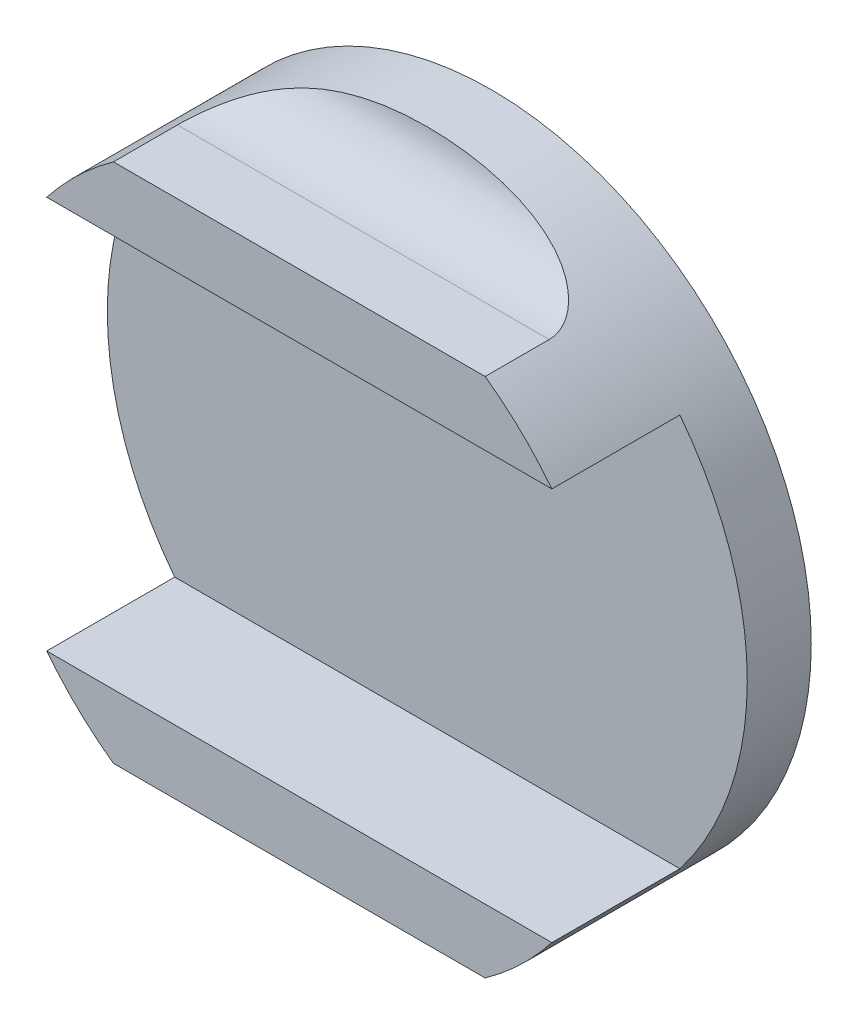
ISO-10303-21;
HEADER;
FILE_DESCRIPTION(('STEP AP214'),'2;1');
FILE_NAME('part.step','',(''),(''),'','','');
FILE_SCHEMA(('AUTOMOTIVE_DESIGN { 1 0 10303 214 1 1 1 1 }'));
ENDSEC;
DATA;
#1=APPLICATION_CONTEXT('core data for automotive mechanical design processes');
#2=APPLICATION_PROTOCOL_DEFINITION('international standard','automotive_design',2000,#1);
#3=PRODUCT_CONTEXT('',#1,'mechanical');
#4=PRODUCT('Part','Part','',(#3));
#5=PRODUCT_RELATED_PRODUCT_CATEGORY('part','',(#4));
#6=PRODUCT_DEFINITION_FORMATION('','',#4);
#7=PRODUCT_DEFINITION_CONTEXT('part definition',#1,'design');
#8=PRODUCT_DEFINITION('design','',#6,#7);
#9=PRODUCT_DEFINITION_SHAPE('','',#8);
#10=(LENGTH_UNIT() NAMED_UNIT(*) SI_UNIT(.MILLI.,.METRE.));
#11=(NAMED_UNIT(*) PLANE_ANGLE_UNIT() SI_UNIT($,.RADIAN.));
#12=(NAMED_UNIT(*) SI_UNIT($,.STERADIAN.) SOLID_ANGLE_UNIT());
#13=UNCERTAINTY_MEASURE_WITH_UNIT(LENGTH_MEASURE(1.E-05),#10,'distance_accuracy_value','');
#14=(GEOMETRIC_REPRESENTATION_CONTEXT(3) GLOBAL_UNCERTAINTY_ASSIGNED_CONTEXT((#13)) GLOBAL_UNIT_ASSIGNED_CONTEXT((#10,
#11,#12)) REPRESENTATION_CONTEXT('',''));
#15=CARTESIAN_POINT('',(0.,0.,0.));
#16=DIRECTION('',(0.,0.,1.));
#17=DIRECTION('',(1.,0.,0.));
#18=AXIS2_PLACEMENT_3D('',#15,#16,#17);
#19=CARTESIAN_POINT('',(0.,0.,5.));
#20=DIRECTION('',(0.,0.,1.));
#21=DIRECTION('',(1.,0.,0.));
#22=AXIS2_PLACEMENT_3D('',#19,#20,#21);
#23=PLANE('',#22);
#24=CARTESIAN_POINT('',(0.,0.,5.));
#25=DIRECTION('',(0.,0.,1.));
#26=DIRECTION('',(1.,0.,0.));
#27=AXIS2_PLACEMENT_3D('',#24,#25,#26);
#28=CIRCLE('',#27,25.);
#29=CARTESIAN_POINT('',(-19.732650607559,15.35,5.));
#30=VERTEX_POINT('',#29);
#31=CARTESIAN_POINT('',(-19.732650607559,-15.35,5.));
#32=VERTEX_POINT('',#31);
#33=EDGE_CURVE('E155',#30,#32,#28,.T.);
#34=ORIENTED_EDGE('',*,*,#33,.T.);
#35=DIRECTION('',(-1.,0.,0.));
#36=VECTOR('',#35,1.);
#37=CARTESIAN_POINT('',(-19.732650607559,-15.35,5.));
#38=LINE('',#37,#36);
#39=CARTESIAN_POINT('',(19.732650607559,-15.35,5.));
#40=VERTEX_POINT('',#39);
#41=EDGE_CURVE('E124',#40,#32,#38,.T.);
#42=ORIENTED_EDGE('',*,*,#41,.F.);
#43=CARTESIAN_POINT('',(19.732650607559,15.35,5.));
#44=VERTEX_POINT('',#43);
#45=EDGE_CURVE('E159',#40,#44,#28,.T.);
#46=ORIENTED_EDGE('',*,*,#45,.T.);
#47=DIRECTION('',(1.,0.,0.));
#48=VECTOR('',#47,1.);
#49=CARTESIAN_POINT('',(-19.732650607559,15.35,5.));
#50=LINE('',#49,#48);
#51=EDGE_CURVE('E128',#30,#44,#50,.T.);
#52=ORIENTED_EDGE('',*,*,#51,.F.);
#53=EDGE_LOOP('',(#34,#42,#46,#52));
#54=FACE_BOUND('',#53,.T.);
#55=ADVANCED_FACE('F33',(#54),#23,.T.);
#56=CARTESIAN_POINT('',(0.,0.,5.));
#57=DIRECTION('',(0.,0.,-1.));
#58=DIRECTION('',(-1.,0.,0.));
#59=AXIS2_PLACEMENT_3D('',#56,#57,#58);
#60=CYLINDRICAL_SURFACE('',#59,25.);
#61=DIRECTION('',(0.,0.,-1.));
#62=VECTOR('',#61,1.);
#63=CARTESIAN_POINT('',(-14.5216218102525,20.35,15.));
#64=LINE('',#63,#62);
#65=CARTESIAN_POINT('',(-14.5216218102525,20.35,15.));
#66=VERTEX_POINT('',#65);
#67=CARTESIAN_POINT('',(-14.5216218102525,20.35,10.));
#68=VERTEX_POINT('',#67);
#69=EDGE_CURVE('E143',#66,#68,#64,.T.);
#70=ORIENTED_EDGE('',*,*,#69,.T.);
#71=CARTESIAN_POINT('',(-14.5216218102525,20.35,10.));
#72=CARTESIAN_POINT('',(-14.5216516923995,20.3499714724112,9.90243900627181));
#73=CARTESIAN_POINT('',(-14.5176214833419,20.3528544616636,9.80490103199293));
#74=CARTESIAN_POINT('',(-14.5016729744672,20.3642248665384,9.61089436509274));
#75=CARTESIAN_POINT('',(-14.4897623888502,20.3727068012637,9.51442472047562));
#76=CARTESIAN_POINT('',(-14.4584484267827,20.3949408021018,9.32437913075647));
#77=CARTESIAN_POINT('',(-14.4391244348287,20.4086370209626,9.23078350576052));
#78=CARTESIAN_POINT('',(-14.3933906550105,20.4409171214255,9.0462201471187));
#79=CARTESIAN_POINT('',(-14.3669796269597,20.4595018584763,8.95525287650742));
#80=CARTESIAN_POINT('',(-14.2780299320764,20.5217709072939,8.68794519812128));
#81=CARTESIAN_POINT('',(-14.2056230108338,20.5720797369634,8.51631655785808));
#82=CARTESIAN_POINT('',(-14.0387802982028,20.6862973737273,8.18887567437971));
#83=CARTESIAN_POINT('',(-13.9442853774472,20.7502426444307,8.03310752533815));
#84=CARTESIAN_POINT('',(-13.6919128216938,20.9180105577739,7.67356335169646));
#85=CARTESIAN_POINT('',(-13.5244560885488,21.0269869449647,7.47888834620155));
#86=CARTESIAN_POINT('',(-13.2537078079582,21.1978974275088,7.21230431590257));
#87=CARTESIAN_POINT('',(-13.1600614586412,21.2561903384449,7.12758623592491));
#88=CARTESIAN_POINT('',(-12.9671410135791,21.3744241421331,6.96605978331645));
#89=CARTESIAN_POINT('',(-12.8678678779717,21.4343647528331,6.8892500674887));
#90=CARTESIAN_POINT('',(-12.6013971298552,21.5926254984877,6.6976053249203));
#91=CARTESIAN_POINT('',(-12.4303046839586,21.691662148574,6.58878012054556));
#92=CARTESIAN_POINT('',(-12.0783272440861,21.8896063175565,6.38813926309017));
#93=CARTESIAN_POINT('',(-11.8974359433717,21.9885137103006,6.29633473705204));
#94=CARTESIAN_POINT('',(-11.5276582562348,22.184611172198,6.1273930114258));
#95=CARTESIAN_POINT('',(-11.3387593217715,22.2817981802464,6.05027995674777));
#96=CARTESIAN_POINT('',(-10.9546858820607,22.4731155272541,5.90882774362362));
#97=CARTESIAN_POINT('',(-10.7595090061419,22.5672446838894,5.84449347808485));
#98=CARTESIAN_POINT('',(-10.3750734682458,22.7464350256905,5.7300930920407));
#99=CARTESIAN_POINT('',(-10.1860889455795,22.8317094180181,5.6794326196711));
#100=CARTESIAN_POINT('',(-9.80435029529547,22.9982190016967,5.58658759994817));
#101=CARTESIAN_POINT('',(-9.61159672855235,23.0794547877577,5.5444018018474));
#102=CARTESIAN_POINT('',(-9.22270784692529,23.237593598521,5.46728716884823));
#103=CARTESIAN_POINT('',(-9.02656987230216,23.3144929919608,5.43236435202442));
#104=CARTESIAN_POINT('',(-8.63151312302899,23.4636226705657,5.36878663083949));
#105=CARTESIAN_POINT('',(-8.43259401532592,23.5358523905896,5.34013248413932));
#106=CARTESIAN_POINT('',(-7.83174350851581,23.7453946533391,5.26211247126874));
#107=CARTESIAN_POINT('',(-7.42617884573038,23.8753729655037,5.2207753765069));
#108=CARTESIAN_POINT('',(-6.60799054978018,24.1146477607422,5.15342531179937));
#109=CARTESIAN_POINT('',(-6.19536892425952,24.2239500226601,5.1274080557337));
#110=CARTESIAN_POINT('',(-5.30770460715272,24.4348898934871,5.08311467280315));
#111=CARTESIAN_POINT('',(-4.83184837066626,24.5334306737602,5.06638553109534));
#112=CARTESIAN_POINT('',(-3.87497303091428,24.7026461510271,5.04134835175687));
#113=CARTESIAN_POINT('',(-3.39395336246248,24.7733177648595,5.03304124569507));
#114=CARTESIAN_POINT('',(-2.42828723732253,24.8865404153771,5.0212006136867));
#115=CARTESIAN_POINT('',(-1.94363885703017,24.9290752847027,5.01766983099781));
#116=CARTESIAN_POINT('',(-0.972648892521851,24.98580491911,5.01319846626932));
#117=CARTESIAN_POINT('',(-0.486307271558883,24.9999990652471,5.01225794079924));
#118=CARTESIAN_POINT('',(0.346717139012412,25.0000006664405,5.01227010679755));
#119=CARTESIAN_POINT('',(0.693416817861538,24.992786774291,5.01275685964154));
#120=CARTESIAN_POINT('',(1.38624356165509,24.9639446310412,5.01490380608671));
#121=CARTESIAN_POINT('',(1.7323705901036,24.9423154942146,5.01656407179325));
#122=CARTESIAN_POINT('',(2.42362988337364,24.8846617381894,5.0216172567383));
#123=CARTESIAN_POINT('',(2.76876138157175,24.8486280328819,5.02501126996564));
#124=CARTESIAN_POINT('',(3.45718173114511,24.7622340071756,5.03447674603174));
#125=CARTESIAN_POINT('',(3.80047064336267,24.7118741628294,5.04054811990644));
#126=CARTESIAN_POINT('',(4.48343599926657,24.5971198652688,5.05666932071661));
#127=CARTESIAN_POINT('',(4.8231206411108,24.5327724397554,5.06670590646896));
#128=CARTESIAN_POINT('',(5.49936502871441,24.3900881633954,5.09247219872061));
#129=CARTESIAN_POINT('',(5.83592449306507,24.3117500653566,5.1082024129043));
#130=CARTESIAN_POINT('',(6.504722510443,24.1414070216506,5.14748145228679));
#131=CARTESIAN_POINT('',(6.83696540799312,24.0494171995019,5.17102166070541));
#132=CARTESIAN_POINT('',(7.49648662463607,23.8520666279075,5.22854568126741));
#133=CARTESIAN_POINT('',(7.82376634335692,23.7467097295704,5.2625264894248));
#134=CARTESIAN_POINT('',(8.3463964537909,23.5665388492418,5.32832505344769));
#135=CARTESIAN_POINT('',(8.54367575946218,23.4957307281106,5.3558685165578));
#136=CARTESIAN_POINT('',(8.9355701050413,23.3495034372951,5.41695529787411));
#137=CARTESIAN_POINT('',(9.13018540667768,23.2740847246221,5.450498022054));
#138=CARTESIAN_POINT('',(9.51681625117018,23.1186876587383,5.5246590258549));
#139=CARTESIAN_POINT('',(9.70882411159728,23.0386984168181,5.56529472027724));
#140=CARTESIAN_POINT('',(10.0892067327021,22.8746762651763,5.65471564050041));
#141=CARTESIAN_POINT('',(10.2775812510787,22.7906430870689,5.7035014077335));
#142=CARTESIAN_POINT('',(10.6940722559844,22.5986957539351,5.82316041586874));
#143=CARTESIAN_POINT('',(10.921049982739,22.4898344027009,5.89652861599841));
#144=CARTESIAN_POINT('',(11.3667859740614,22.2678729599111,6.06051432624465));
#145=CARTESIAN_POINT('',(11.5855402204199,22.1547708487631,6.1511401410079));
#146=CARTESIAN_POINT('',(12.0113343865606,21.9268297380312,6.3524080587819));
#147=CARTESIAN_POINT('',(12.2184229870933,21.8120009570067,6.46295740579907));
#148=CARTESIAN_POINT('',(12.6183098682107,21.5831220578433,6.70778405105816));
#149=CARTESIAN_POINT('',(12.8111282680551,21.4690710575005,6.84202700340795));
#150=CARTESIAN_POINT('',(13.153903571847,21.2605193321099,7.11867076336138));
#151=CARTESIAN_POINT('',(13.3061687584127,21.1654115202872,7.25771272909902));
#152=CARTESIAN_POINT('',(13.5920572866386,20.9829625362129,7.55868873691377));
#153=CARTESIAN_POINT('',(13.7256716913447,20.8956250945331,7.7206336791705));
#154=CARTESIAN_POINT('',(13.969926912868,20.7331368645016,8.07072742116919));
#155=CARTESIAN_POINT('',(14.0802515436404,20.6581565018536,8.25918529170803));
#156=CARTESIAN_POINT('',(14.2209875002086,20.5612934256962,8.5580322589075));
#157=CARTESIAN_POINT('',(14.2637406192793,20.5316312231127,8.6602192010931));
#158=CARTESIAN_POINT('',(14.3402026377994,20.4782996492524,8.86944472195147));
#159=CARTESIAN_POINT('',(14.3739158156824,20.454627443323,8.97648097739643));
#160=CARTESIAN_POINT('',(14.4220874441203,20.4206747348683,9.15895476837892));
#161=CARTESIAN_POINT('',(14.4392423748917,20.4085425694188,9.23335116605105));
#162=CARTESIAN_POINT('',(14.468837266532,20.3875716015334,9.38351995801654));
#163=CARTESIAN_POINT('',(14.4812787163047,20.3787317591269,9.45929190985841));
#164=CARTESIAN_POINT('',(14.5013409645407,20.3644610042783,9.61227404186909));
#165=CARTESIAN_POINT('',(14.5089313282383,20.3590516154371,9.68949023322893));
#166=CARTESIAN_POINT('',(14.5190796094078,20.3518140225531,9.84446820118627));
#167=CARTESIAN_POINT('',(14.5216343003175,20.3499881145967,9.92223029556868));
#168=CARTESIAN_POINT('',(14.5216218102525,20.35,10.));
#169=B_SPLINE_CURVE_WITH_KNOTS('',3,(#71,#72,#73,#74,#75,#76,#77,#78,#79,#80,#81,#82,#83,#84,
#85,#86,#87,#88,#89,#90,#91,#92,#93,#94,#95,#96,#97,#98,#99,#100,#101,#102,#103,#104,#105,#106,
#107,#108,#109,#110,#111,#112,#113,#114,#115,#116,#117,#118,#119,#120,#121,#122,#123,#124,#125,
#126,#127,#128,#129,#130,#131,#132,#133,#134,#135,#136,#137,#138,#139,#140,#141,#142,#143,#144,
#145,#146,#147,#148,#149,#150,#151,#152,#153,#154,#155,#156,#157,#158,#159,#160,#161,#162,#163,
#164,#165,#166,#167,#168),.UNSPECIFIED.,.F.,.F.,(4,2,2,2,2,2,2,2,2,2,2,2,2,2,2,2,2,2,2,2,2,2,2,
2,2,2,2,2,2,2,2,2,2,2,2,2,2,2,2,2,2,2,2,2,2,2,2,2,4),(0.,0.29251995502069,0.584753981399756,
0.873942309821987,1.16318127742063,1.73899303055195,2.31636424600612,3.14821752708743,
3.56524495778431,3.98220144116351,4.65810653957343,5.33445195582071,6.0118995101745,
6.68960595646517,7.32963922299213,7.96957795974437,8.61004485272044,9.25058911282249,
10.5331861205216,11.8154241179224,13.2731676564417,14.7310724196833,16.1898141682981,
17.6485877746186,18.6886335251767,19.7287431859119,20.7695099645422,21.8102421629063,
22.8475279877528,23.8849063271729,24.9211439104466,25.9570836245479,26.5911664620937,
27.2251865496484,27.8607857727334,28.4964272372672,29.2824175392958,30.0687870329245,
30.8515858769157,31.6332591701271,32.3127784949128,32.992622317513,33.6811741354416,
34.0246900415259,34.3680430798935,34.5997610328093,34.8314057290444,35.0644898107987,
35.297723190607),.UNSPECIFIED.);
#170=CARTESIAN_POINT('',(14.5216218102525,20.35,10.));
#171=VERTEX_POINT('',#170);
#172=EDGE_CURVE('E11',#68,#171,#169,.T.);
#173=ORIENTED_EDGE('',*,*,#172,.T.);
#174=DIRECTION('',(0.,0.,-1.));
#175=VECTOR('',#174,1.);
#176=CARTESIAN_POINT('',(14.5216218102525,20.35,15.));
#177=LINE('',#176,#175);
#178=CARTESIAN_POINT('',(14.5216218102525,20.35,15.));
#179=VERTEX_POINT('',#178);
#180=EDGE_CURVE('E146',#179,#171,#177,.T.);
#181=ORIENTED_EDGE('',*,*,#180,.F.);
#182=CARTESIAN_POINT('',(0.,0.,15.));
#183=DIRECTION('',(0.,0.,1.));
#184=DIRECTION('',(1.,0.,0.));
#185=AXIS2_PLACEMENT_3D('',#182,#183,#184);
#186=CIRCLE('',#185,25.);
#187=CARTESIAN_POINT('',(19.732650607559,15.35,15.));
#188=VERTEX_POINT('',#187);
#189=EDGE_CURVE('E140',#188,#179,#186,.T.);
#190=ORIENTED_EDGE('',*,*,#189,.F.);
#191=DIRECTION('',(0.,0.,-1.));
#192=VECTOR('',#191,1.);
#193=CARTESIAN_POINT('',(19.732650607559,15.35,15.));
#194=LINE('',#193,#192);
#195=EDGE_CURVE('E148',#188,#44,#194,.T.);
#196=ORIENTED_EDGE('',*,*,#195,.T.);
#197=ORIENTED_EDGE('',*,*,#45,.F.);
#198=DIRECTION('',(0.,0.,-1.));
#199=VECTOR('',#198,1.);
#200=CARTESIAN_POINT('',(19.732650607559,-15.35,15.));
#201=LINE('',#200,#199);
#202=CARTESIAN_POINT('',(19.732650607559,-15.35,15.));
#203=VERTEX_POINT('',#202);
#204=EDGE_CURVE('E71',#203,#40,#201,.T.);
#205=ORIENTED_EDGE('',*,*,#204,.F.);
#206=CARTESIAN_POINT('',(0.,0.,15.));
#207=DIRECTION('',(0.,0.,1.));
#208=DIRECTION('',(-1.,0.,0.));
#209=AXIS2_PLACEMENT_3D('',#206,#207,#208);
#210=CIRCLE('',#209,25.);
#211=CARTESIAN_POINT('',(14.5216218102525,-20.35,15.));
#212=VERTEX_POINT('',#211);
#213=EDGE_CURVE('E116',#212,#203,#210,.T.);
#214=ORIENTED_EDGE('',*,*,#213,.F.);
#215=DIRECTION('',(0.,0.,-1.));
#216=VECTOR('',#215,1.);
#217=CARTESIAN_POINT('',(14.5216218102525,-20.35,15.));
#218=LINE('',#217,#216);
#219=CARTESIAN_POINT('',(14.5216218102525,-20.35,10.));
#220=VERTEX_POINT('',#219);
#221=EDGE_CURVE('E113',#212,#220,#218,.T.);
#222=ORIENTED_EDGE('',*,*,#221,.T.);
#223=CARTESIAN_POINT('',(14.5216218102525,-20.35,10.));
#224=CARTESIAN_POINT('',(14.5216516923995,-20.3499714724112,9.90243900627181));
#225=CARTESIAN_POINT('',(14.5176214833419,-20.3528544616636,9.80490103199293));
#226=CARTESIAN_POINT('',(14.5016729744672,-20.3642248665384,9.61089436509274));
#227=CARTESIAN_POINT('',(14.4897623888502,-20.3727068012637,9.51442472047562));
#228=CARTESIAN_POINT('',(14.4584484267827,-20.3949408021018,9.32437913075647));
#229=CARTESIAN_POINT('',(14.4391244348287,-20.4086370209626,9.23078350576052));
#230=CARTESIAN_POINT('',(14.3933906550105,-20.4409171214255,9.0462201471187));
#231=CARTESIAN_POINT('',(14.3669796269597,-20.4595018584763,8.95525287650742));
#232=CARTESIAN_POINT('',(14.2780299320764,-20.5217709072939,8.68794519812128));
#233=CARTESIAN_POINT('',(14.2056230108338,-20.5720797369634,8.51631655785808));
#234=CARTESIAN_POINT('',(14.0387802982028,-20.6862973737273,8.18887567437971));
#235=CARTESIAN_POINT('',(13.9442853774472,-20.7502426444307,8.03310752533815));
#236=CARTESIAN_POINT('',(13.6919128216938,-20.9180105577739,7.67356335169646));
#237=CARTESIAN_POINT('',(13.5244560885488,-21.0269869449647,7.47888834620155));
#238=CARTESIAN_POINT('',(13.2537078079582,-21.1978974275088,7.21230431590257));
#239=CARTESIAN_POINT('',(13.1600614586412,-21.2561903384449,7.12758623592491));
#240=CARTESIAN_POINT('',(12.9671410135791,-21.3744241421331,6.96605978331645));
#241=CARTESIAN_POINT('',(12.8678678779717,-21.4343647528331,6.8892500674887));
#242=CARTESIAN_POINT('',(12.6013971298552,-21.5926254984877,6.6976053249203));
#243=CARTESIAN_POINT('',(12.4303046839586,-21.691662148574,6.58878012054556));
#244=CARTESIAN_POINT('',(12.0783272440861,-21.8896063175565,6.38813926309017));
#245=CARTESIAN_POINT('',(11.8974359433717,-21.9885137103006,6.29633473705204));
#246=CARTESIAN_POINT('',(11.5276582562348,-22.184611172198,6.1273930114258));
#247=CARTESIAN_POINT('',(11.3387593217715,-22.2817981802464,6.05027995674777));
#248=CARTESIAN_POINT('',(10.9546858820607,-22.4731155272541,5.90882774362362));
#249=CARTESIAN_POINT('',(10.7595090061419,-22.5672446838894,5.84449347808485));
#250=CARTESIAN_POINT('',(10.3750734682458,-22.7464350256905,5.7300930920407));
#251=CARTESIAN_POINT('',(10.1860889455795,-22.8317094180181,5.6794326196711));
#252=CARTESIAN_POINT('',(9.80435029529547,-22.9982190016967,5.58658759994817));
#253=CARTESIAN_POINT('',(9.61159672855235,-23.0794547877577,5.5444018018474));
#254=CARTESIAN_POINT('',(9.22270784692529,-23.237593598521,5.46728716884823));
#255=CARTESIAN_POINT('',(9.02656987230216,-23.3144929919608,5.43236435202442));
#256=CARTESIAN_POINT('',(8.63151312302899,-23.4636226705657,5.36878663083949));
#257=CARTESIAN_POINT('',(8.43259401532592,-23.5358523905896,5.34013248413932));
#258=CARTESIAN_POINT('',(7.83174350851581,-23.7453946533391,5.26211247126874));
#259=CARTESIAN_POINT('',(7.42617884573038,-23.8753729655037,5.2207753765069));
#260=CARTESIAN_POINT('',(6.60799054978018,-24.1146477607422,5.15342531179937));
#261=CARTESIAN_POINT('',(6.19536892425952,-24.2239500226601,5.1274080557337));
#262=CARTESIAN_POINT('',(5.30770460715272,-24.4348898934871,5.08311467280315));
#263=CARTESIAN_POINT('',(4.83184837066626,-24.5334306737602,5.06638553109534));
#264=CARTESIAN_POINT('',(3.87497303091428,-24.7026461510271,5.04134835175687));
#265=CARTESIAN_POINT('',(3.39395336246248,-24.7733177648595,5.03304124569507));
#266=CARTESIAN_POINT('',(2.42828723732252,-24.8865404153771,5.0212006136867));
#267=CARTESIAN_POINT('',(1.94363885703016,-24.9290752847027,5.01766983099781));
#268=CARTESIAN_POINT('',(0.972648892521844,-24.98580491911,5.01319846626932));
#269=CARTESIAN_POINT('',(0.486307271558874,-24.9999990652471,5.01225794079924));
#270=CARTESIAN_POINT('',(-0.34671713901242,-25.0000006664405,5.01227010679755));
#271=CARTESIAN_POINT('',(-0.693416817861546,-24.992786774291,5.01275685964154));
#272=CARTESIAN_POINT('',(-1.3862435616551,-24.9639446310412,5.01490380608671));
#273=CARTESIAN_POINT('',(-1.73237059010361,-24.9423154942146,5.01656407179326));
#274=CARTESIAN_POINT('',(-2.42362988337364,-24.8846617381894,5.0216172567383));
#275=CARTESIAN_POINT('',(-2.76876138157176,-24.8486280328819,5.02501126996564));
#276=CARTESIAN_POINT('',(-3.45718173114511,-24.7622340071756,5.03447674603174));
#277=CARTESIAN_POINT('',(-3.80047064336267,-24.7118741628294,5.04054811990644));
#278=CARTESIAN_POINT('',(-4.48343599926657,-24.5971198652688,5.05666932071661));
#279=CARTESIAN_POINT('',(-4.82312064111081,-24.5327724397554,5.06670590646896));
#280=CARTESIAN_POINT('',(-5.49936502871441,-24.3900881633954,5.09247219872061));
#281=CARTESIAN_POINT('',(-5.83592449306507,-24.3117500653566,5.1082024129043));
#282=CARTESIAN_POINT('',(-6.50472251044301,-24.1414070216506,5.14748145228679));
#283=CARTESIAN_POINT('',(-6.83696540799312,-24.0494171995019,5.17102166070541));
#284=CARTESIAN_POINT('',(-7.49648662463607,-23.8520666279075,5.22854568126741));
#285=CARTESIAN_POINT('',(-7.82376634335692,-23.7467097295704,5.2625264894248));
#286=CARTESIAN_POINT('',(-8.34639645379091,-23.5665388492418,5.32832505344769));
#287=CARTESIAN_POINT('',(-8.54367575946218,-23.4957307281106,5.3558685165578));
#288=CARTESIAN_POINT('',(-8.9355701050413,-23.3495034372951,5.41695529787412));
#289=CARTESIAN_POINT('',(-9.13018540667768,-23.2740847246221,5.450498022054));
#290=CARTESIAN_POINT('',(-9.51681625117018,-23.1186876587383,5.5246590258549));
#291=CARTESIAN_POINT('',(-9.70882411159728,-23.0386984168181,5.56529472027724));
#292=CARTESIAN_POINT('',(-10.0892067327021,-22.8746762651763,5.65471564050041));
#293=CARTESIAN_POINT('',(-10.2775812510787,-22.7906430870689,5.7035014077335));
#294=CARTESIAN_POINT('',(-10.6940722559844,-22.5986957539351,5.82316041586874));
#295=CARTESIAN_POINT('',(-10.921049982739,-22.4898344027009,5.89652861599841));
#296=CARTESIAN_POINT('',(-11.3667859740614,-22.2678729599111,6.06051432624466));
#297=CARTESIAN_POINT('',(-11.58554022042,-22.1547708487631,6.1511401410079));
#298=CARTESIAN_POINT('',(-12.0113343865606,-21.9268297380312,6.35240805878191));
#299=CARTESIAN_POINT('',(-12.2184229870933,-21.8120009570067,6.46295740579907));
#300=CARTESIAN_POINT('',(-12.6183098682107,-21.5831220578433,6.70778405105816));
#301=CARTESIAN_POINT('',(-12.8111282680551,-21.4690710575005,6.84202700340795));
#302=CARTESIAN_POINT('',(-13.153903571847,-21.2605193321099,7.11867076336139));
#303=CARTESIAN_POINT('',(-13.3061687584127,-21.1654115202872,7.25771272909903));
#304=CARTESIAN_POINT('',(-13.5920572866386,-20.9829625362129,7.55868873691378));
#305=CARTESIAN_POINT('',(-13.7256716913447,-20.8956250945331,7.7206336791705));
#306=CARTESIAN_POINT('',(-13.969926912868,-20.7331368645016,8.0707274211692));
#307=CARTESIAN_POINT('',(-14.0802515436404,-20.6581565018536,8.25918529170804));
#308=CARTESIAN_POINT('',(-14.2209875002086,-20.5612934256962,8.55803225890751));
#309=CARTESIAN_POINT('',(-14.2637406192793,-20.5316312231127,8.66021920109311));
#310=CARTESIAN_POINT('',(-14.3402026377994,-20.4782996492524,8.86944472195148));
#311=CARTESIAN_POINT('',(-14.3739158156824,-20.454627443323,8.97648097739643));
#312=CARTESIAN_POINT('',(-14.4220874441203,-20.4206747348683,9.15895476837893));
#313=CARTESIAN_POINT('',(-14.4392423748917,-20.4085425694188,9.23335116605105));
#314=CARTESIAN_POINT('',(-14.468837266532,-20.3875716015334,9.38351995801654));
#315=CARTESIAN_POINT('',(-14.4812787163047,-20.3787317591269,9.45929190985842));
#316=CARTESIAN_POINT('',(-14.5013409645407,-20.3644610042783,9.61227404186909));
#317=CARTESIAN_POINT('',(-14.5089313282383,-20.3590516154371,9.68949023322893));
#318=CARTESIAN_POINT('',(-14.5190796094078,-20.3518140225531,9.84446820118627));
#319=CARTESIAN_POINT('',(-14.5216343003175,-20.3499881145967,9.92223029556868));
#320=CARTESIAN_POINT('',(-14.5216218102525,-20.35,10.));
#321=B_SPLINE_CURVE_WITH_KNOTS('',3,(#223,#224,#225,#226,#227,#228,#229,#230,#231,#232,#233,
#234,#235,#236,#237,#238,#239,#240,#241,#242,#243,#244,#245,#246,#247,#248,#249,#250,#251,#252,
#253,#254,#255,#256,#257,#258,#259,#260,#261,#262,#263,#264,#265,#266,#267,#268,#269,#270,#271,
#272,#273,#274,#275,#276,#277,#278,#279,#280,#281,#282,#283,#284,#285,#286,#287,#288,#289,#290,
#291,#292,#293,#294,#295,#296,#297,#298,#299,#300,#301,#302,#303,#304,#305,#306,#307,#308,#309,
#310,#311,#312,#313,#314,#315,#316,#317,#318,#319,#320),.UNSPECIFIED.,.F.,.F.,(4,2,2,2,2,2,2,2,
2,2,2,2,2,2,2,2,2,2,2,2,2,2,2,2,2,2,2,2,2,2,2,2,2,2,2,2,2,2,2,2,2,2,2,2,2,2,2,2,4),(0.,
0.29251995502069,0.584753981399756,0.873942309821987,1.16318127742063,1.73899303055195,
2.31636424600612,3.14821752708743,3.56524495778431,3.98220144116351,4.65810653957343,
5.33445195582071,6.0118995101745,6.68960595646517,7.32963922299213,7.96957795974437,
8.61004485272044,9.25058911282249,10.5331861205216,11.8154241179224,13.2731676564417,
14.7310724196833,16.1898141682981,17.6485877746187,18.6886335251767,19.7287431859119,
20.7695099645422,21.8102421629063,22.8475279877528,23.8849063271729,24.9211439104466,
25.9570836245479,26.5911664620937,27.2251865496484,27.8607857727334,28.4964272372672,
29.2824175392958,30.0687870329245,30.8515858769157,31.6332591701271,32.3127784949128,
32.992622317513,33.6811741354416,34.0246900415259,34.3680430798935,34.5997610328093,
34.8314057290444,35.0644898107987,35.297723190607),.UNSPECIFIED.);
#322=CARTESIAN_POINT('',(-14.5216218102525,-20.35,10.));
#323=VERTEX_POINT('',#322);
#324=EDGE_CURVE('E48',#220,#323,#321,.T.);
#325=ORIENTED_EDGE('',*,*,#324,.T.);
#326=DIRECTION('',(0.,0.,-1.));
#327=VECTOR('',#326,1.);
#328=CARTESIAN_POINT('',(-14.5216218102525,-20.35,15.));
#329=LINE('',#328,#327);
#330=CARTESIAN_POINT('',(-14.5216218102525,-20.35,15.));
#331=VERTEX_POINT('',#330);
#332=EDGE_CURVE('E111',#331,#323,#329,.T.);
#333=ORIENTED_EDGE('',*,*,#332,.F.);
#334=CARTESIAN_POINT('',(0.,0.,15.));
#335=DIRECTION('',(0.,0.,1.));
#336=DIRECTION('',(-1.,0.,0.));
#337=AXIS2_PLACEMENT_3D('',#334,#335,#336);
#338=CIRCLE('',#337,25.);
#339=CARTESIAN_POINT('',(-19.732650607559,-15.35,15.));
#340=VERTEX_POINT('',#339);
#341=EDGE_CURVE('E117',#340,#331,#338,.T.);
#342=ORIENTED_EDGE('',*,*,#341,.F.);
#343=DIRECTION('',(0.,0.,-1.));
#344=VECTOR('',#343,1.);
#345=CARTESIAN_POINT('',(-19.732650607559,-15.35,15.));
#346=LINE('',#345,#344);
#347=EDGE_CURVE('E213',#340,#32,#346,.T.);
#348=ORIENTED_EDGE('',*,*,#347,.T.);
#349=ORIENTED_EDGE('',*,*,#33,.F.);
#350=DIRECTION('',(0.,0.,-1.));
#351=VECTOR('',#350,1.);
#352=CARTESIAN_POINT('',(-19.732650607559,15.35,15.));
#353=LINE('',#352,#351);
#354=CARTESIAN_POINT('',(-19.732650607559,15.35,15.));
#355=VERTEX_POINT('',#354);
#356=EDGE_CURVE('E151',#355,#30,#353,.T.);
#357=ORIENTED_EDGE('',*,*,#356,.F.);
#358=CARTESIAN_POINT('',(0.,0.,15.));
#359=DIRECTION('',(0.,0.,1.));
#360=DIRECTION('',(1.,0.,0.));
#361=AXIS2_PLACEMENT_3D('',#358,#359,#360);
#362=CIRCLE('',#361,25.);
#363=EDGE_CURVE('E131',#66,#355,#362,.T.);
#364=ORIENTED_EDGE('',*,*,#363,.F.);
#365=EDGE_LOOP('',(#70,#173,#181,#190,#196,#197,#205,#214,#222,#325,#333,#342,#348,#349,#357,#364));
#366=FACE_BOUND('',#365,.T.);
#367=CARTESIAN_POINT('',(0.,0.,0.));
#368=DIRECTION('',(0.,0.,1.));
#369=DIRECTION('',(1.,0.,0.));
#370=AXIS2_PLACEMENT_3D('',#367,#368,#369);
#371=CIRCLE('',#370,25.);
#372=CARTESIAN_POINT('',(25.,0.,0.));
#373=VERTEX_POINT('',#372);
#374=EDGE_CURVE('E154',#373,#373,#371,.T.);
#375=ORIENTED_EDGE('',*,*,#374,.T.);
#376=EDGE_LOOP('',(#375));
#377=FACE_BOUND('',#376,.T.);
#378=ADVANCED_FACE('F126',(#366,#377),#60,.T.);
#379=CARTESIAN_POINT('',(0.,0.,0.));
#380=DIRECTION('',(0.,0.,1.));
#381=DIRECTION('',(1.,0.,0.));
#382=AXIS2_PLACEMENT_3D('',#379,#380,#381);
#383=PLANE('',#382);
#384=ORIENTED_EDGE('',*,*,#374,.F.);
#385=EDGE_LOOP('',(#384));
#386=FACE_BOUND('',#385,.T.);
#387=ADVANCED_FACE('F187',(#386),#383,.F.);
#388=CARTESIAN_POINT('',(-19.732650607559,15.35,15.));
#389=DIRECTION('',(0.,1.,0.));
#390=DIRECTION('',(0.,0.,1.));
#391=AXIS2_PLACEMENT_3D('',#388,#389,#390);
#392=PLANE('',#391);
#393=ORIENTED_EDGE('',*,*,#51,.T.);
#394=ORIENTED_EDGE('',*,*,#195,.F.);
#395=DIRECTION('',(1.,0.,0.));
#396=VECTOR('',#395,1.);
#397=CARTESIAN_POINT('',(-19.732650607559,15.35,15.));
#398=LINE('',#397,#396);
#399=EDGE_CURVE('E138',#355,#188,#398,.T.);
#400=ORIENTED_EDGE('',*,*,#399,.F.);
#401=ORIENTED_EDGE('',*,*,#356,.T.);
#402=EDGE_LOOP('',(#393,#394,#400,#401));
#403=FACE_BOUND('',#402,.T.);
#404=ADVANCED_FACE('F189',(#403),#392,.F.);
#405=CARTESIAN_POINT('',(-14.5216218102525,20.35,15.));
#406=DIRECTION('',(0.,-1.,0.));
#407=DIRECTION('',(0.,0.,-1.));
#408=AXIS2_PLACEMENT_3D('',#405,#406,#407);
#409=PLANE('',#408);
#410=ORIENTED_EDGE('',*,*,#180,.T.);
#411=DIRECTION('',(-1.,0.,0.));
#412=VECTOR('',#411,1.);
#413=CARTESIAN_POINT('',(-14.5216218102525,20.35,10.));
#414=LINE('',#413,#412);
#415=EDGE_CURVE('E163',#171,#68,#414,.T.);
#416=ORIENTED_EDGE('',*,*,#415,.T.);
#417=ORIENTED_EDGE('',*,*,#69,.F.);
#418=DIRECTION('',(-1.,0.,0.));
#419=VECTOR('',#418,1.);
#420=CARTESIAN_POINT('',(-14.5216218102525,20.35,15.));
#421=LINE('',#420,#419);
#422=EDGE_CURVE('E142',#179,#66,#421,.T.);
#423=ORIENTED_EDGE('',*,*,#422,.F.);
#424=EDGE_LOOP('',(#410,#416,#417,#423));
#425=FACE_BOUND('',#424,.T.);
#426=ADVANCED_FACE('F196',(#425),#409,.F.);
#427=CARTESIAN_POINT('',(0.,0.,15.));
#428=DIRECTION('',(0.,0.,1.));
#429=DIRECTION('',(1.,0.,0.));
#430=AXIS2_PLACEMENT_3D('',#427,#428,#429);
#431=PLANE('',#430);
#432=ORIENTED_EDGE('',*,*,#363,.T.);
#433=ORIENTED_EDGE('',*,*,#399,.T.);
#434=ORIENTED_EDGE('',*,*,#189,.T.);
#435=ORIENTED_EDGE('',*,*,#422,.T.);
#436=EDGE_LOOP('',(#432,#433,#434,#435));
#437=FACE_BOUND('',#436,.T.);
#438=ADVANCED_FACE('F202',(#437),#431,.T.);
#439=CARTESIAN_POINT('',(-14.5216218102525,-20.35,15.));
#440=DIRECTION('',(0.,1.,0.));
#441=DIRECTION('',(0.,0.,1.));
#442=AXIS2_PLACEMENT_3D('',#439,#440,#441);
#443=PLANE('',#442);
#444=ORIENTED_EDGE('',*,*,#332,.T.);
#445=DIRECTION('',(1.,0.,0.));
#446=VECTOR('',#445,1.);
#447=CARTESIAN_POINT('',(-14.5216218102525,-20.35,10.));
#448=LINE('',#447,#446);
#449=EDGE_CURVE('E158',#323,#220,#448,.T.);
#450=ORIENTED_EDGE('',*,*,#449,.T.);
#451=ORIENTED_EDGE('',*,*,#221,.F.);
#452=DIRECTION('',(1.,0.,0.));
#453=VECTOR('',#452,1.);
#454=CARTESIAN_POINT('',(-14.5216218102525,-20.35,15.));
#455=LINE('',#454,#453);
#456=EDGE_CURVE('E107',#331,#212,#455,.T.);
#457=ORIENTED_EDGE('',*,*,#456,.F.);
#458=EDGE_LOOP('',(#444,#450,#451,#457));
#459=FACE_BOUND('',#458,.T.);
#460=ADVANCED_FACE('F109',(#459),#443,.F.);
#461=CARTESIAN_POINT('',(-19.732650607559,-15.35,15.));
#462=DIRECTION('',(0.,-1.,0.));
#463=DIRECTION('',(0.,0.,-1.));
#464=AXIS2_PLACEMENT_3D('',#461,#462,#463);
#465=PLANE('',#464);
#466=ORIENTED_EDGE('',*,*,#41,.T.);
#467=ORIENTED_EDGE('',*,*,#347,.F.);
#468=DIRECTION('',(-1.,0.,0.));
#469=VECTOR('',#468,1.);
#470=CARTESIAN_POINT('',(-19.732650607559,-15.35,15.));
#471=LINE('',#470,#469);
#472=EDGE_CURVE('E121',#203,#340,#471,.T.);
#473=ORIENTED_EDGE('',*,*,#472,.F.);
#474=ORIENTED_EDGE('',*,*,#204,.T.);
#475=EDGE_LOOP('',(#466,#467,#473,#474));
#476=FACE_BOUND('',#475,.T.);
#477=ADVANCED_FACE('F179',(#476),#465,.F.);
#478=CARTESIAN_POINT('',(0.,0.,15.));
#479=DIRECTION('',(0.,0.,-1.));
#480=DIRECTION('',(-1.,0.,0.));
#481=AXIS2_PLACEMENT_3D('',#478,#479,#480);
#482=PLANE('',#481);
#483=ORIENTED_EDGE('',*,*,#341,.T.);
#484=ORIENTED_EDGE('',*,*,#456,.T.);
#485=ORIENTED_EDGE('',*,*,#213,.T.);
#486=ORIENTED_EDGE('',*,*,#472,.T.);
#487=EDGE_LOOP('',(#483,#484,#485,#486));
#488=FACE_BOUND('',#487,.T.);
#489=ADVANCED_FACE('F120',(#488),#482,.F.);
#490=CARTESIAN_POINT('',(-14.5216218102525,-25.35,10.));
#491=DIRECTION('',(1.,0.,0.));
#492=DIRECTION('',(0.,0.,-1.));
#493=AXIS2_PLACEMENT_3D('',#490,#491,#492);
#494=CYLINDRICAL_SURFACE('',#493,5.);
#495=ORIENTED_EDGE('',*,*,#449,.F.);
#496=ORIENTED_EDGE('',*,*,#324,.F.);
#497=EDGE_LOOP('',(#495,#496));
#498=FACE_BOUND('',#497,.T.);
#499=ADVANCED_FACE('F171',(#498),#494,.F.);
#500=CARTESIAN_POINT('',(-14.5216218102525,25.35,10.));
#501=DIRECTION('',(-1.,0.,0.));
#502=DIRECTION('',(0.,0.,1.));
#503=AXIS2_PLACEMENT_3D('',#500,#501,#502);
#504=CYLINDRICAL_SURFACE('',#503,5.);
#505=ORIENTED_EDGE('',*,*,#415,.F.);
#506=ORIENTED_EDGE('',*,*,#172,.F.);
#507=EDGE_LOOP('',(#505,#506));
#508=FACE_BOUND('',#507,.T.);
#509=ADVANCED_FACE('F35',(#508),#504,.F.);
#510=CLOSED_SHELL('',(#55,#378,#387,#404,#426,#438,#460,#477,#489,#499,#509));
#511=MANIFOLD_SOLID_BREP('B2',#510);
#512=ADVANCED_BREP_SHAPE_REPRESENTATION('',(#18,#511),#14);
#513=SHAPE_DEFINITION_REPRESENTATION(#9,#512);
ENDSEC;
END-ISO-10303-21;
